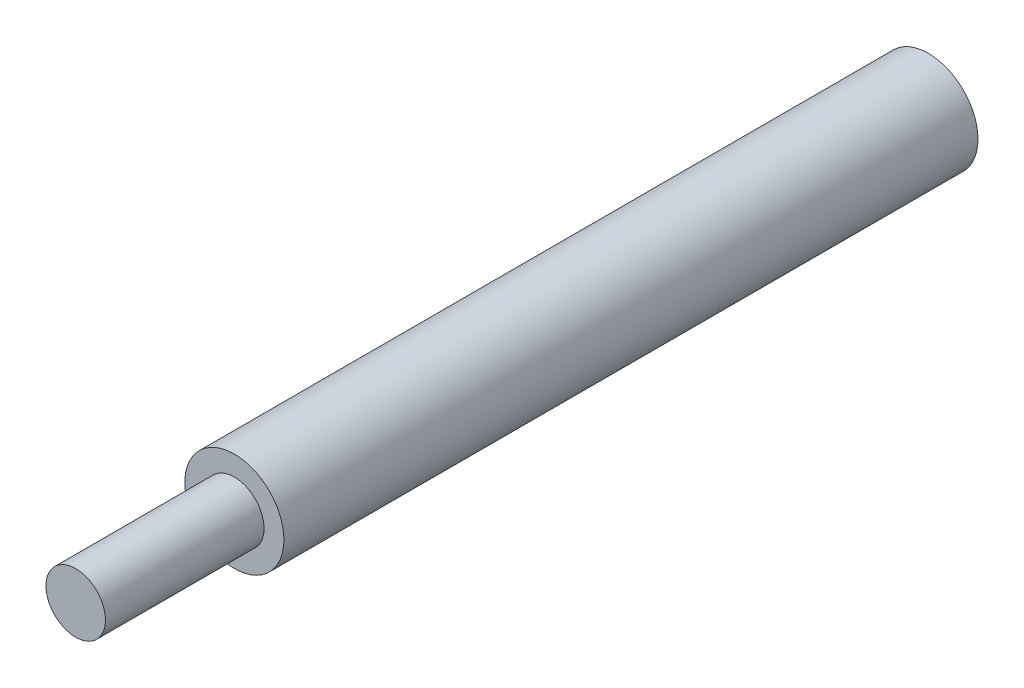
ISO-10303-21;
HEADER;
FILE_DESCRIPTION(('STEP AP214'),'2;1');
FILE_NAME('part.step','',(''),(''),'','','');
FILE_SCHEMA(('AUTOMOTIVE_DESIGN { 1 0 10303 214 1 1 1 1 }'));
ENDSEC;
DATA;
#1=APPLICATION_CONTEXT('core data for automotive mechanical design processes');
#2=APPLICATION_PROTOCOL_DEFINITION('international standard','automotive_design',2000,#1);
#3=PRODUCT_CONTEXT('',#1,'mechanical');
#4=PRODUCT('Part','Part','',(#3));
#5=PRODUCT_RELATED_PRODUCT_CATEGORY('part','',(#4));
#6=PRODUCT_DEFINITION_FORMATION('','',#4);
#7=PRODUCT_DEFINITION_CONTEXT('part definition',#1,'design');
#8=PRODUCT_DEFINITION('design','',#6,#7);
#9=PRODUCT_DEFINITION_SHAPE('','',#8);
#10=(LENGTH_UNIT() NAMED_UNIT(*) SI_UNIT(.MILLI.,.METRE.));
#11=(NAMED_UNIT(*) PLANE_ANGLE_UNIT() SI_UNIT($,.RADIAN.));
#12=(NAMED_UNIT(*) SI_UNIT($,.STERADIAN.) SOLID_ANGLE_UNIT());
#13=UNCERTAINTY_MEASURE_WITH_UNIT(LENGTH_MEASURE(1.E-05),#10,'distance_accuracy_value','');
#14=(GEOMETRIC_REPRESENTATION_CONTEXT(3) GLOBAL_UNCERTAINTY_ASSIGNED_CONTEXT((#13)) GLOBAL_UNIT_ASSIGNED_CONTEXT((#10,
#11,#12)) REPRESENTATION_CONTEXT('',''));
#15=CARTESIAN_POINT('',(0.,0.,0.));
#16=DIRECTION('',(0.,0.,1.));
#17=DIRECTION('',(1.,0.,0.));
#18=AXIS2_PLACEMENT_3D('',#15,#16,#17);
#19=CARTESIAN_POINT('',(0.,0.,35.));
#20=DIRECTION('',(0.,0.,-1.));
#21=DIRECTION('',(-1.,0.,0.));
#22=AXIS2_PLACEMENT_3D('',#19,#20,#21);
#23=CYLINDRICAL_SURFACE('',#22,2.5);
#24=CARTESIAN_POINT('',(0.,0.,35.));
#25=DIRECTION('',(0.,0.,1.));
#26=DIRECTION('',(1.,0.,0.));
#27=AXIS2_PLACEMENT_3D('',#24,#25,#26);
#28=CIRCLE('',#27,2.5);
#29=CARTESIAN_POINT('',(2.5,0.,35.));
#30=VERTEX_POINT('',#29);
#31=EDGE_CURVE('E44',#30,#30,#28,.T.);
#32=ORIENTED_EDGE('',*,*,#31,.F.);
#33=EDGE_LOOP('',(#32));
#34=FACE_BOUND('',#33,.T.);
#35=CARTESIAN_POINT('',(0.,0.,0.));
#36=DIRECTION('',(0.,0.,1.));
#37=DIRECTION('',(1.,0.,0.));
#38=AXIS2_PLACEMENT_3D('',#35,#36,#37);
#39=CIRCLE('',#38,2.5);
#40=CARTESIAN_POINT('',(2.5,0.,0.));
#41=VERTEX_POINT('',#40);
#42=EDGE_CURVE('E40',#41,#41,#39,.T.);
#43=ORIENTED_EDGE('',*,*,#42,.T.);
#44=EDGE_LOOP('',(#43));
#45=FACE_BOUND('',#44,.T.);
#46=ADVANCED_FACE('F37',(#34,#45),#23,.T.);
#47=CARTESIAN_POINT('',(0.,0.,35.));
#48=DIRECTION('',(0.,0.,1.));
#49=DIRECTION('',(1.,0.,0.));
#50=AXIS2_PLACEMENT_3D('',#47,#48,#49);
#51=PLANE('',#50);
#52=CARTESIAN_POINT('',(0.,0.,35.));
#53=DIRECTION('',(0.,0.,1.));
#54=DIRECTION('',(1.,0.,0.));
#55=AXIS2_PLACEMENT_3D('',#52,#53,#54);
#56=CIRCLE('',#55,1.5);
#57=CARTESIAN_POINT('',(1.5,0.,35.));
#58=VERTEX_POINT('',#57);
#59=EDGE_CURVE('E10',#58,#58,#56,.T.);
#60=ORIENTED_EDGE('',*,*,#59,.F.);
#61=EDGE_LOOP('',(#60));
#62=FACE_BOUND('',#61,.T.);
#63=ORIENTED_EDGE('',*,*,#31,.T.);
#64=EDGE_LOOP('',(#63));
#65=FACE_BOUND('',#64,.T.);
#66=ADVANCED_FACE('F61',(#62,#65),#51,.T.);
#67=CARTESIAN_POINT('',(0.,0.,0.));
#68=DIRECTION('',(0.,0.,1.));
#69=DIRECTION('',(1.,0.,0.));
#70=AXIS2_PLACEMENT_3D('',#67,#68,#69);
#71=PLANE('',#70);
#72=ORIENTED_EDGE('',*,*,#42,.F.);
#73=EDGE_LOOP('',(#72));
#74=FACE_BOUND('',#73,.T.);
#75=ADVANCED_FACE('F58',(#74),#71,.F.);
#76=CARTESIAN_POINT('',(0.,0.,43.));
#77=DIRECTION('',(0.,0.,-1.));
#78=DIRECTION('',(-1.,0.,0.));
#79=AXIS2_PLACEMENT_3D('',#76,#77,#78);
#80=CYLINDRICAL_SURFACE('',#79,1.5);
#81=CARTESIAN_POINT('',(0.,0.,43.));
#82=DIRECTION('',(0.,0.,1.));
#83=DIRECTION('',(1.,0.,0.));
#84=AXIS2_PLACEMENT_3D('',#81,#82,#83);
#85=CIRCLE('',#84,1.5);
#86=CARTESIAN_POINT('',(1.5,0.,43.));
#87=VERTEX_POINT('',#86);
#88=EDGE_CURVE('E50',#87,#87,#85,.T.);
#89=ORIENTED_EDGE('',*,*,#88,.F.);
#90=EDGE_LOOP('',(#89));
#91=FACE_BOUND('',#90,.T.);
#92=ORIENTED_EDGE('',*,*,#59,.T.);
#93=EDGE_LOOP('',(#92));
#94=FACE_BOUND('',#93,.T.);
#95=ADVANCED_FACE('F60',(#91,#94),#80,.T.);
#96=CARTESIAN_POINT('',(0.,0.,43.));
#97=DIRECTION('',(0.,0.,1.));
#98=DIRECTION('',(1.,0.,0.));
#99=AXIS2_PLACEMENT_3D('',#96,#97,#98);
#100=PLANE('',#99);
#101=ORIENTED_EDGE('',*,*,#88,.T.);
#102=EDGE_LOOP('',(#101));
#103=FACE_BOUND('',#102,.T.);
#104=ADVANCED_FACE('F66',(#103),#100,.T.);
#105=CLOSED_SHELL('',(#46,#66,#75,#95,#104));
#106=MANIFOLD_SOLID_BREP('B2',#105);
#107=ADVANCED_BREP_SHAPE_REPRESENTATION('',(#18,#106),#14);
#108=SHAPE_DEFINITION_REPRESENTATION(#9,#107);
ENDSEC;
END-ISO-10303-21;
